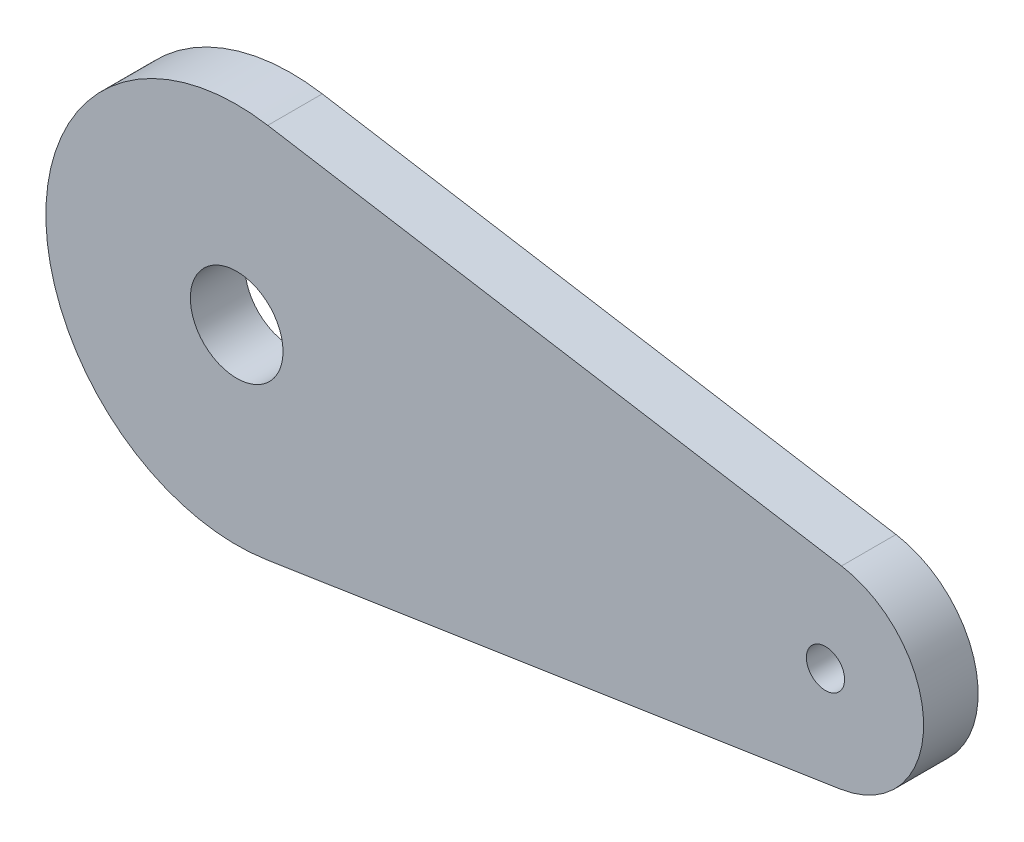
ISO-10303-21;
HEADER;
FILE_DESCRIPTION(('STEP AP214'),'2;1');
FILE_NAME('part.step','',(''),(''),'','','');
FILE_SCHEMA(('AUTOMOTIVE_DESIGN { 1 0 10303 214 1 1 1 1 }'));
ENDSEC;
DATA;
#1=APPLICATION_CONTEXT('core data for automotive mechanical design processes');
#2=APPLICATION_PROTOCOL_DEFINITION('international standard','automotive_design',2000,#1);
#3=PRODUCT_CONTEXT('',#1,'mechanical');
#4=PRODUCT('Part','Part','',(#3));
#5=PRODUCT_RELATED_PRODUCT_CATEGORY('part','',(#4));
#6=PRODUCT_DEFINITION_FORMATION('','',#4);
#7=PRODUCT_DEFINITION_CONTEXT('part definition',#1,'design');
#8=PRODUCT_DEFINITION('design','',#6,#7);
#9=PRODUCT_DEFINITION_SHAPE('','',#8);
#10=(LENGTH_UNIT() NAMED_UNIT(*) SI_UNIT(.MILLI.,.METRE.));
#11=(NAMED_UNIT(*) PLANE_ANGLE_UNIT() SI_UNIT($,.RADIAN.));
#12=(NAMED_UNIT(*) SI_UNIT($,.STERADIAN.) SOLID_ANGLE_UNIT());
#13=UNCERTAINTY_MEASURE_WITH_UNIT(LENGTH_MEASURE(1.E-05),#10,'distance_accuracy_value','');
#14=(GEOMETRIC_REPRESENTATION_CONTEXT(3) GLOBAL_UNCERTAINTY_ASSIGNED_CONTEXT((#13)) GLOBAL_UNIT_ASSIGNED_CONTEXT((#10,
#11,#12)) REPRESENTATION_CONTEXT('',''));
#15=CARTESIAN_POINT('',(0.,0.,0.));
#16=DIRECTION('',(0.,0.,1.));
#17=DIRECTION('',(1.,0.,0.));
#18=AXIS2_PLACEMENT_3D('',#15,#16,#17);
#19=CARTESIAN_POINT('',(-20.22,57.5800000000001,-5.));
#20=DIRECTION('',(0.,0.,1.));
#21=DIRECTION('',(1.,0.,0.));
#22=AXIS2_PLACEMENT_3D('',#19,#20,#21);
#23=CYLINDRICAL_SURFACE('',#22,17.5);
#24=CARTESIAN_POINT('',(-20.22,57.5800000000001,0.));
#25=DIRECTION('',(0.,0.,1.));
#26=DIRECTION('',(1.,0.,0.));
#27=AXIS2_PLACEMENT_3D('',#24,#25,#26);
#28=CIRCLE('',#27,17.5);
#29=CARTESIAN_POINT('',(-17.3694213771346,74.8462735271647,0.));
#30=VERTEX_POINT('',#29);
#31=CARTESIAN_POINT('',(-17.5614043505102,40.2831254507495,0.));
#32=VERTEX_POINT('',#31);
#33=EDGE_CURVE('E104',#30,#32,#28,.T.);
#34=ORIENTED_EDGE('',*,*,#33,.F.);
#35=DIRECTION('',(0.,0.,1.));
#36=VECTOR('',#35,1.);
#37=CARTESIAN_POINT('',(-17.3694213771346,74.8462735271647,-5.));
#38=LINE('',#37,#36);
#39=CARTESIAN_POINT('',(-17.3694213771346,74.8462735271647,-5.));
#40=VERTEX_POINT('',#39);
#41=EDGE_CURVE('E11',#40,#30,#38,.T.);
#42=ORIENTED_EDGE('',*,*,#41,.F.);
#43=CARTESIAN_POINT('',(-20.22,57.5800000000001,-5.));
#44=DIRECTION('',(0.,0.,1.));
#45=DIRECTION('',(1.,0.,0.));
#46=AXIS2_PLACEMENT_3D('',#43,#44,#45);
#47=CIRCLE('',#46,17.5);
#48=CARTESIAN_POINT('',(-17.5614043505102,40.2831254507495,-5.));
#49=VERTEX_POINT('',#48);
#50=EDGE_CURVE('E97',#40,#49,#47,.T.);
#51=ORIENTED_EDGE('',*,*,#50,.T.);
#52=DIRECTION('',(0.,0.,1.));
#53=VECTOR('',#52,1.);
#54=CARTESIAN_POINT('',(-17.5614043505102,40.2831254507495,-5.));
#55=LINE('',#54,#53);
#56=EDGE_CURVE('E42',#49,#32,#55,.T.);
#57=ORIENTED_EDGE('',*,*,#56,.T.);
#58=EDGE_LOOP('',(#34,#42,#51,#57));
#59=FACE_BOUND('',#58,.T.);
#60=ADVANCED_FACE('F39',(#59),#23,.T.);
#61=CARTESIAN_POINT('',(-17.3694213771346,74.8462735271647,-5.));
#62=DIRECTION('',(0.162890207020882,0.986644201552259,0.));
#63=DIRECTION('',(-0.986644201552259,0.162890207020882,0.));
#64=AXIS2_PLACEMENT_3D('',#61,#62,#63);
#65=PLANE('',#64);
#66=DIRECTION('',(-0.986644201552259,0.162890207020882,0.));
#67=VECTOR('',#66,1.);
#68=CARTESIAN_POINT('',(-17.3694213771346,74.8462735271647,0.));
#69=LINE('',#68,#67);
#70=CARTESIAN_POINT('',(35.2451788486937,66.1598563672376,0.));
#71=VERTEX_POINT('',#70);
#72=EDGE_CURVE('E99',#71,#30,#69,.T.);
#73=ORIENTED_EDGE('',*,*,#72,.F.);
#74=DIRECTION('',(0.,0.,1.));
#75=VECTOR('',#74,1.);
#76=CARTESIAN_POINT('',(35.2451788486937,66.1598563672376,-5.));
#77=LINE('',#76,#75);
#78=CARTESIAN_POINT('',(35.2451788486937,66.1598563672376,-5.));
#79=VERTEX_POINT('',#78);
#80=EDGE_CURVE('E48',#79,#71,#77,.T.);
#81=ORIENTED_EDGE('',*,*,#80,.F.);
#82=DIRECTION('',(-0.986644201552259,0.162890207020882,0.));
#83=VECTOR('',#82,1.);
#84=CARTESIAN_POINT('',(-17.3694213771346,74.8462735271647,-5.));
#85=LINE('',#84,#83);
#86=EDGE_CURVE('E94',#79,#40,#85,.T.);
#87=ORIENTED_EDGE('',*,*,#86,.T.);
#88=ORIENTED_EDGE('',*,*,#41,.T.);
#89=EDGE_LOOP('',(#73,#81,#87,#88));
#90=FACE_BOUND('',#89,.T.);
#91=ADVANCED_FACE('F115',(#90),#65,.T.);
#92=CARTESIAN_POINT('',(33.7791669855057,57.2800585532673,-5.));
#93=DIRECTION('',(0.,0.,1.));
#94=DIRECTION('',(1.,0.,0.));
#95=AXIS2_PLACEMENT_3D('',#92,#93,#94);
#96=CYLINDRICAL_SURFACE('',#95,9.);
#97=CARTESIAN_POINT('',(33.7791669855057,57.2800585532673,0.));
#98=DIRECTION('',(0.,0.,1.));
#99=DIRECTION('',(-1.,0.,0.));
#100=AXIS2_PLACEMENT_3D('',#97,#98,#99);
#101=CIRCLE('',#100,9.);
#102=CARTESIAN_POINT('',(35.1464447481005,48.3845230707955,0.));
#103=VERTEX_POINT('',#102);
#104=EDGE_CURVE('E89',#103,#71,#101,.T.);
#105=ORIENTED_EDGE('',*,*,#104,.F.);
#106=DIRECTION('',(0.,0.,1.));
#107=VECTOR('',#106,1.);
#108=CARTESIAN_POINT('',(35.1464447481005,48.3845230707955,-5.));
#109=LINE('',#108,#107);
#110=CARTESIAN_POINT('',(35.1464447481005,48.3845230707955,-5.));
#111=VERTEX_POINT('',#110);
#112=EDGE_CURVE('E84',#111,#103,#109,.T.);
#113=ORIENTED_EDGE('',*,*,#112,.F.);
#114=CARTESIAN_POINT('',(33.7791669855057,57.2800585532673,-5.));
#115=DIRECTION('',(0.,0.,1.));
#116=DIRECTION('',(-1.,0.,0.));
#117=AXIS2_PLACEMENT_3D('',#114,#115,#116);
#118=CIRCLE('',#117,9.);
#119=EDGE_CURVE('E87',#111,#79,#118,.T.);
#120=ORIENTED_EDGE('',*,*,#119,.T.);
#121=ORIENTED_EDGE('',*,*,#80,.T.);
#122=EDGE_LOOP('',(#105,#113,#120,#121));
#123=FACE_BOUND('',#122,.T.);
#124=ADVANCED_FACE('F86',(#123),#96,.T.);
#125=CARTESIAN_POINT('',(-17.5614043505102,40.2831254507495,-5.));
#126=DIRECTION('',(0.151919751399419,-0.98839283138575,0.));
#127=DIRECTION('',(0.98839283138575,0.151919751399419,0.));
#128=AXIS2_PLACEMENT_3D('',#125,#126,#127);
#129=PLANE('',#128);
#130=DIRECTION('',(0.98839283138575,0.151919751399419,0.));
#131=VECTOR('',#130,1.);
#132=CARTESIAN_POINT('',(-17.5614043505102,40.2831254507495,0.));
#133=LINE('',#132,#131);
#134=EDGE_CURVE('E107',#32,#103,#133,.T.);
#135=ORIENTED_EDGE('',*,*,#134,.F.);
#136=ORIENTED_EDGE('',*,*,#56,.F.);
#137=DIRECTION('',(0.98839283138575,0.151919751399419,0.));
#138=VECTOR('',#137,1.);
#139=CARTESIAN_POINT('',(-17.5614043505102,40.2831254507495,-5.));
#140=LINE('',#139,#138);
#141=EDGE_CURVE('E93',#49,#111,#140,.T.);
#142=ORIENTED_EDGE('',*,*,#141,.T.);
#143=ORIENTED_EDGE('',*,*,#112,.T.);
#144=EDGE_LOOP('',(#135,#136,#142,#143));
#145=FACE_BOUND('',#144,.T.);
#146=ADVANCED_FACE('F96',(#145),#129,.T.);
#147=CARTESIAN_POINT('',(-20.22,57.5800000000001,-5.));
#148=DIRECTION('',(0.,0.,1.));
#149=DIRECTION('',(1.,0.,0.));
#150=AXIS2_PLACEMENT_3D('',#147,#148,#149);
#151=PLANE('',#150);
#152=CARTESIAN_POINT('',(33.7791669855057,57.2800585532673,-5.));
#153=DIRECTION('',(0.,0.,1.));
#154=DIRECTION('',(1.,0.,0.));
#155=AXIS2_PLACEMENT_3D('',#152,#153,#154);
#156=CIRCLE('',#155,1.75);
#157=CARTESIAN_POINT('',(35.5291669855057,57.2800585532673,-5.));
#158=VERTEX_POINT('',#157);
#159=EDGE_CURVE('E148',#158,#158,#156,.T.);
#160=ORIENTED_EDGE('',*,*,#159,.T.);
#161=EDGE_LOOP('',(#160));
#162=FACE_BOUND('',#161,.T.);
#163=CARTESIAN_POINT('',(-20.22,57.5800000000001,-5.));
#164=DIRECTION('',(0.,0.,1.));
#165=DIRECTION('',(1.,0.,0.));
#166=AXIS2_PLACEMENT_3D('',#163,#164,#165);
#167=CIRCLE('',#166,4.25);
#168=CARTESIAN_POINT('',(-15.97,57.5800000000001,-5.));
#169=VERTEX_POINT('',#168);
#170=EDGE_CURVE('E108',#169,#169,#167,.T.);
#171=ORIENTED_EDGE('',*,*,#170,.T.);
#172=EDGE_LOOP('',(#171));
#173=FACE_BOUND('',#172,.T.);
#174=ORIENTED_EDGE('',*,*,#50,.F.);
#175=ORIENTED_EDGE('',*,*,#86,.F.);
#176=ORIENTED_EDGE('',*,*,#119,.F.);
#177=ORIENTED_EDGE('',*,*,#141,.F.);
#178=EDGE_LOOP('',(#174,#175,#176,#177));
#179=FACE_BOUND('',#178,.T.);
#180=ADVANCED_FACE('F92',(#162,#173,#179),#151,.F.);
#181=CARTESIAN_POINT('',(-20.22,57.5800000000001,0.));
#182=DIRECTION('',(0.,0.,1.));
#183=DIRECTION('',(1.,0.,0.));
#184=AXIS2_PLACEMENT_3D('',#181,#182,#183);
#185=PLANE('',#184);
#186=CARTESIAN_POINT('',(33.7791669855057,57.2800585532673,0.));
#187=DIRECTION('',(0.,0.,1.));
#188=DIRECTION('',(1.,0.,0.));
#189=AXIS2_PLACEMENT_3D('',#186,#187,#188);
#190=CIRCLE('',#189,1.75);
#191=CARTESIAN_POINT('',(35.5291669855057,57.2800585532673,0.));
#192=VERTEX_POINT('',#191);
#193=EDGE_CURVE('E151',#192,#192,#190,.T.);
#194=ORIENTED_EDGE('',*,*,#193,.F.);
#195=EDGE_LOOP('',(#194));
#196=FACE_BOUND('',#195,.T.);
#197=CARTESIAN_POINT('',(-20.22,57.5800000000001,0.));
#198=DIRECTION('',(0.,0.,1.));
#199=DIRECTION('',(1.,0.,0.));
#200=AXIS2_PLACEMENT_3D('',#197,#198,#199);
#201=CIRCLE('',#200,4.25);
#202=CARTESIAN_POINT('',(-15.97,57.5800000000001,0.));
#203=VERTEX_POINT('',#202);
#204=EDGE_CURVE('E153',#203,#203,#201,.T.);
#205=ORIENTED_EDGE('',*,*,#204,.F.);
#206=EDGE_LOOP('',(#205));
#207=FACE_BOUND('',#206,.T.);
#208=ORIENTED_EDGE('',*,*,#33,.T.);
#209=ORIENTED_EDGE('',*,*,#134,.T.);
#210=ORIENTED_EDGE('',*,*,#104,.T.);
#211=ORIENTED_EDGE('',*,*,#72,.T.);
#212=EDGE_LOOP('',(#208,#209,#210,#211));
#213=FACE_BOUND('',#212,.T.);
#214=ADVANCED_FACE('F114',(#196,#207,#213),#185,.T.);
#215=CARTESIAN_POINT('',(-20.22,57.5800000000001,-5.));
#216=DIRECTION('',(0.,0.,1.));
#217=DIRECTION('',(1.,0.,0.));
#218=AXIS2_PLACEMENT_3D('',#215,#216,#217);
#219=CYLINDRICAL_SURFACE('',#218,4.25);
#220=ORIENTED_EDGE('',*,*,#170,.F.);
#221=EDGE_LOOP('',(#220));
#222=FACE_BOUND('',#221,.T.);
#223=ORIENTED_EDGE('',*,*,#204,.T.);
#224=EDGE_LOOP('',(#223));
#225=FACE_BOUND('',#224,.T.);
#226=ADVANCED_FACE('F133',(#222,#225),#219,.F.);
#227=CARTESIAN_POINT('',(33.7791669855057,57.2800585532673,-5.));
#228=DIRECTION('',(0.,0.,1.));
#229=DIRECTION('',(1.,0.,0.));
#230=AXIS2_PLACEMENT_3D('',#227,#228,#229);
#231=CYLINDRICAL_SURFACE('',#230,1.75);
#232=ORIENTED_EDGE('',*,*,#159,.F.);
#233=EDGE_LOOP('',(#232));
#234=FACE_BOUND('',#233,.T.);
#235=ORIENTED_EDGE('',*,*,#193,.T.);
#236=EDGE_LOOP('',(#235));
#237=FACE_BOUND('',#236,.T.);
#238=ADVANCED_FACE('F140',(#234,#237),#231,.F.);
#239=CLOSED_SHELL('',(#60,#91,#124,#146,#180,#214,#226,#238));
#240=MANIFOLD_SOLID_BREP('B2',#239);
#241=ADVANCED_BREP_SHAPE_REPRESENTATION('',(#18,#240),#14);
#242=SHAPE_DEFINITION_REPRESENTATION(#9,#241);
ENDSEC;
END-ISO-10303-21;
